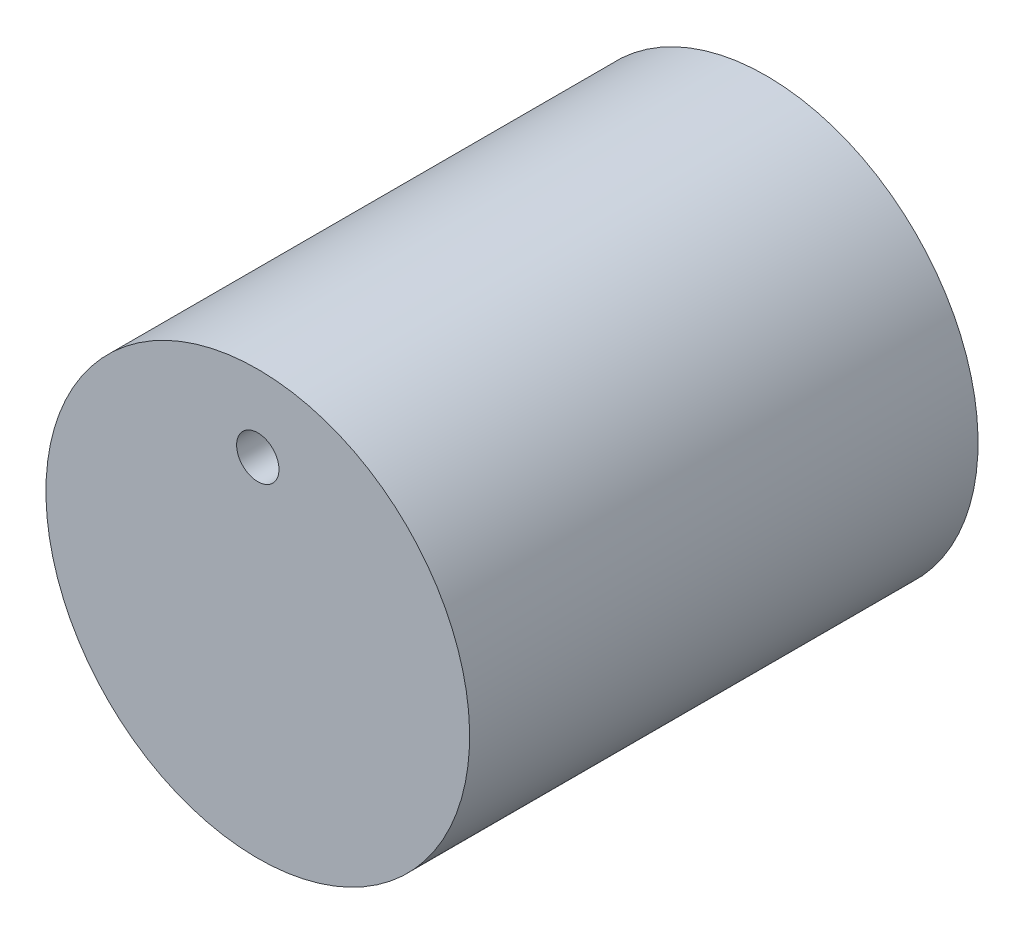
ISO-10303-21;
HEADER;
FILE_DESCRIPTION(('STEP AP214'),'2;1');
FILE_NAME('part.step','',(''),(''),'','','');
FILE_SCHEMA(('AUTOMOTIVE_DESIGN { 1 0 10303 214 1 1 1 1 }'));
ENDSEC;
DATA;
#1=APPLICATION_CONTEXT('core data for automotive mechanical design processes');
#2=APPLICATION_PROTOCOL_DEFINITION('international standard','automotive_design',2000,#1);
#3=PRODUCT_CONTEXT('',#1,'mechanical');
#4=PRODUCT('Part','Part','',(#3));
#5=PRODUCT_RELATED_PRODUCT_CATEGORY('part','',(#4));
#6=PRODUCT_DEFINITION_FORMATION('','',#4);
#7=PRODUCT_DEFINITION_CONTEXT('part definition',#1,'design');
#8=PRODUCT_DEFINITION('design','',#6,#7);
#9=PRODUCT_DEFINITION_SHAPE('','',#8);
#10=(LENGTH_UNIT() NAMED_UNIT(*) SI_UNIT(.MILLI.,.METRE.));
#11=(NAMED_UNIT(*) PLANE_ANGLE_UNIT() SI_UNIT($,.RADIAN.));
#12=(NAMED_UNIT(*) SI_UNIT($,.STERADIAN.) SOLID_ANGLE_UNIT());
#13=UNCERTAINTY_MEASURE_WITH_UNIT(LENGTH_MEASURE(1.E-05),#10,'distance_accuracy_value','');
#14=(GEOMETRIC_REPRESENTATION_CONTEXT(3) GLOBAL_UNCERTAINTY_ASSIGNED_CONTEXT((#13)) GLOBAL_UNIT_ASSIGNED_CONTEXT((#10,
#11,#12)) REPRESENTATION_CONTEXT('',''));
#15=CARTESIAN_POINT('',(0.,0.,0.));
#16=DIRECTION('',(0.,0.,1.));
#17=DIRECTION('',(1.,0.,0.));
#18=AXIS2_PLACEMENT_3D('',#15,#16,#17);
#19=CARTESIAN_POINT('',(-2.37499999999973,4.1136206679759,33.5));
#20=DIRECTION('',(0.,0.,1.));
#21=DIRECTION('',(-0.499999999999992,0.866025403784443,0.));
#22=AXIS2_PLACEMENT_3D('',#19,#20,#21);
#23=CYLINDRICAL_SURFACE('',#22,1.25);
#24=CARTESIAN_POINT('',(-2.37499999999973,4.1136206679759,33.5));
#25=DIRECTION('',(0.,0.,1.));
#26=DIRECTION('',(-0.499999999999992,0.866025403784443,0.));
#27=AXIS2_PLACEMENT_3D('',#24,#25,#26);
#28=CIRCLE('',#27,1.25);
#29=CARTESIAN_POINT('',(-2.99999999999972,5.19615242270646,33.5));
#30=VERTEX_POINT('',#29);
#31=EDGE_CURVE('E10',#30,#30,#28,.T.);
#32=ORIENTED_EDGE('',*,*,#31,.T.);
#33=EDGE_LOOP('',(#32));
#34=FACE_BOUND('',#33,.T.);
#35=CARTESIAN_POINT('',(-2.37499999999972,4.11362066797589,36.5));
#36=DIRECTION('',(0.,0.,1.));
#37=DIRECTION('',(-0.499999999999992,0.866025403784443,0.));
#38=AXIS2_PLACEMENT_3D('',#35,#36,#37);
#39=CIRCLE('',#38,1.25);
#40=CARTESIAN_POINT('',(-2.99999999999971,5.19615242270645,36.5));
#41=VERTEX_POINT('',#40);
#42=EDGE_CURVE('E41',#41,#41,#39,.T.);
#43=ORIENTED_EDGE('',*,*,#42,.F.);
#44=EDGE_LOOP('',(#43));
#45=FACE_BOUND('',#44,.T.);
#46=ADVANCED_FACE('F38',(#34,#45),#23,.T.);
#47=CARTESIAN_POINT('',(-2.37499999999973,4.1136206679759,33.5));
#48=DIRECTION('',(0.,0.,1.));
#49=DIRECTION('',(-0.499999999999992,0.866025403784443,0.));
#50=AXIS2_PLACEMENT_3D('',#47,#48,#49);
#51=PLANE('',#50);
#52=CARTESIAN_POINT('',(-2.37499999999972,4.91362066797589,33.5));
#53=DIRECTION('',(0.,0.,1.));
#54=DIRECTION('',(1.,0.,0.));
#55=AXIS2_PLACEMENT_3D('',#52,#53,#54);
#56=CIRCLE('',#55,0.125);
#57=CARTESIAN_POINT('',(-2.24999999999972,4.91362066797589,33.5));
#58=VERTEX_POINT('',#57);
#59=EDGE_CURVE('E48',#58,#58,#56,.F.);
#60=ORIENTED_EDGE('',*,*,#59,.F.);
#61=EDGE_LOOP('',(#60));
#62=FACE_BOUND('',#61,.T.);
#63=ORIENTED_EDGE('',*,*,#31,.F.);
#64=EDGE_LOOP('',(#63));
#65=FACE_BOUND('',#64,.T.);
#66=ADVANCED_FACE('F61',(#62,#65),#51,.F.);
#67=CARTESIAN_POINT('',(-2.37499999999972,4.11362066797589,36.5));
#68=DIRECTION('',(0.,0.,1.));
#69=DIRECTION('',(-0.499999999999992,0.866025403784443,0.));
#70=AXIS2_PLACEMENT_3D('',#67,#68,#69);
#71=PLANE('',#70);
#72=CARTESIAN_POINT('',(-2.37499999999972,4.91362066797589,36.5));
#73=DIRECTION('',(0.,0.,1.));
#74=DIRECTION('',(1.,0.,0.));
#75=AXIS2_PLACEMENT_3D('',#72,#73,#74);
#76=CIRCLE('',#75,0.125);
#77=CARTESIAN_POINT('',(-2.24999999999972,4.91362066797589,36.5));
#78=VERTEX_POINT('',#77);
#79=EDGE_CURVE('E52',#78,#78,#76,.T.);
#80=ORIENTED_EDGE('',*,*,#79,.F.);
#81=EDGE_LOOP('',(#80));
#82=FACE_BOUND('',#81,.T.);
#83=ORIENTED_EDGE('',*,*,#42,.T.);
#84=EDGE_LOOP('',(#83));
#85=FACE_BOUND('',#84,.T.);
#86=ADVANCED_FACE('F58',(#82,#85),#71,.T.);
#87=CARTESIAN_POINT('',(-2.37499999999972,4.91362066797589,33.1464466094068));
#88=DIRECTION('',(0.,0.,1.));
#89=DIRECTION('',(1.,0.,0.));
#90=AXIS2_PLACEMENT_3D('',#87,#88,#89);
#91=CYLINDRICAL_SURFACE('',#90,0.125);
#92=ORIENTED_EDGE('',*,*,#59,.T.);
#93=EDGE_LOOP('',(#92));
#94=FACE_BOUND('',#93,.T.);
#95=ORIENTED_EDGE('',*,*,#79,.T.);
#96=EDGE_LOOP('',(#95));
#97=FACE_BOUND('',#96,.T.);
#98=ADVANCED_FACE('F56',(#94,#97),#91,.F.);
#99=CLOSED_SHELL('',(#46,#66,#86,#98));
#100=MANIFOLD_SOLID_BREP('B2',#99);
#101=ADVANCED_BREP_SHAPE_REPRESENTATION('',(#18,#100),#14);
#102=SHAPE_DEFINITION_REPRESENTATION(#9,#101);
ENDSEC;
END-ISO-10303-21;
